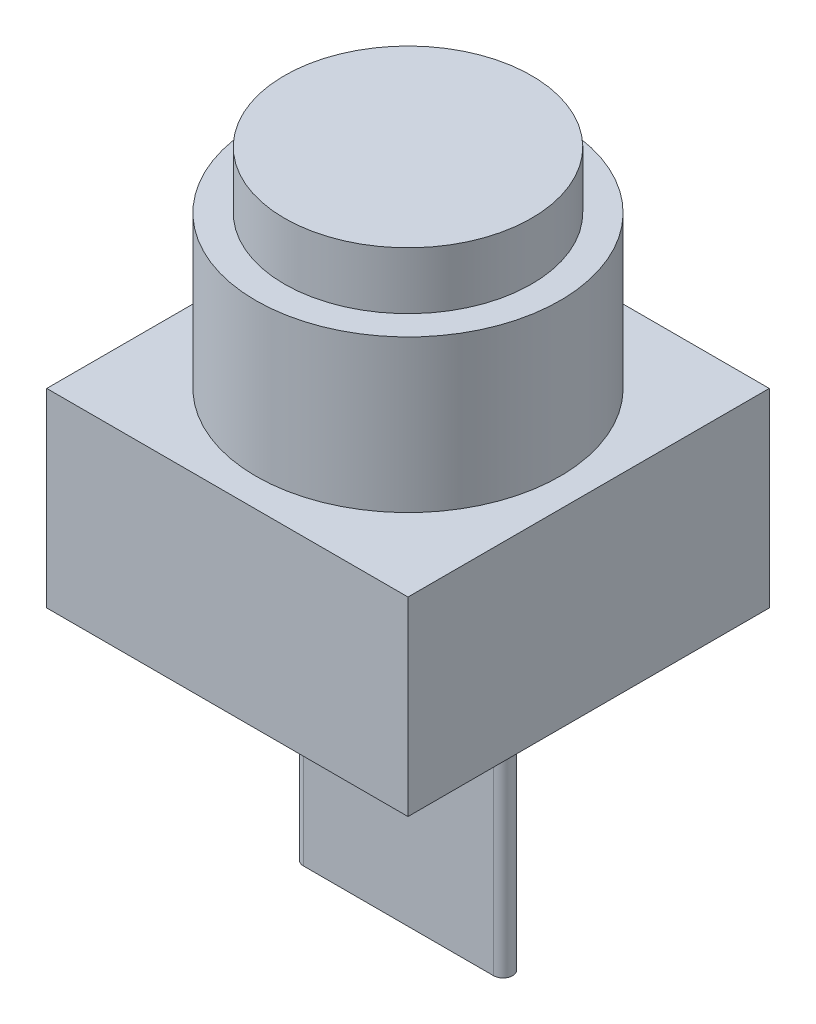
ISO-10303-21;
HEADER;
FILE_DESCRIPTION(('STEP AP214'),'2;1');
FILE_NAME('part.step','',(''),(''),'','','');
FILE_SCHEMA(('AUTOMOTIVE_DESIGN { 1 0 10303 214 1 1 1 1 }'));
ENDSEC;
DATA;
#1=APPLICATION_CONTEXT('core data for automotive mechanical design processes');
#2=APPLICATION_PROTOCOL_DEFINITION('international standard','automotive_design',2000,#1);
#3=PRODUCT_CONTEXT('',#1,'mechanical');
#4=PRODUCT('Part','Part','',(#3));
#5=PRODUCT_RELATED_PRODUCT_CATEGORY('part','',(#4));
#6=PRODUCT_DEFINITION_FORMATION('','',#4);
#7=PRODUCT_DEFINITION_CONTEXT('part definition',#1,'design');
#8=PRODUCT_DEFINITION('design','',#6,#7);
#9=PRODUCT_DEFINITION_SHAPE('','',#8);
#10=(LENGTH_UNIT() NAMED_UNIT(*) SI_UNIT(.MILLI.,.METRE.));
#11=(NAMED_UNIT(*) PLANE_ANGLE_UNIT() SI_UNIT($,.RADIAN.));
#12=(NAMED_UNIT(*) SI_UNIT($,.STERADIAN.) SOLID_ANGLE_UNIT());
#13=UNCERTAINTY_MEASURE_WITH_UNIT(LENGTH_MEASURE(1.E-05),#10,'distance_accuracy_value','');
#14=(GEOMETRIC_REPRESENTATION_CONTEXT(3) GLOBAL_UNCERTAINTY_ASSIGNED_CONTEXT((#13)) GLOBAL_UNIT_ASSIGNED_CONTEXT((#10,
#11,#12)) REPRESENTATION_CONTEXT('',''));
#15=CARTESIAN_POINT('',(0.,0.,0.));
#16=DIRECTION('',(0.,0.,1.));
#17=DIRECTION('',(1.,0.,0.));
#18=AXIS2_PLACEMENT_3D('',#15,#16,#17);
#19=CARTESIAN_POINT('',(0.,0.,0.));
#20=DIRECTION('',(0.,-1.,0.));
#21=DIRECTION('',(0.,0.,-1.));
#22=AXIS2_PLACEMENT_3D('',#19,#20,#21);
#23=PLANE('',#22);
#24=DIRECTION('',(0.,0.,-1.));
#25=VECTOR('',#24,1.);
#26=CARTESIAN_POINT('',(4.75,0.,4.75));
#27=LINE('',#26,#25);
#28=CARTESIAN_POINT('',(4.75,0.,4.75));
#29=VERTEX_POINT('',#28);
#30=CARTESIAN_POINT('',(4.75,0.,-4.75));
#31=VERTEX_POINT('',#30);
#32=EDGE_CURVE('E149',#29,#31,#27,.T.);
#33=ORIENTED_EDGE('',*,*,#32,.F.);
#34=DIRECTION('',(1.,0.,0.));
#35=VECTOR('',#34,1.);
#36=CARTESIAN_POINT('',(-4.75,0.,4.75));
#37=LINE('',#36,#35);
#38=CARTESIAN_POINT('',(-4.75,0.,4.75));
#39=VERTEX_POINT('',#38);
#40=EDGE_CURVE('E84',#39,#29,#37,.T.);
#41=ORIENTED_EDGE('',*,*,#40,.F.);
#42=DIRECTION('',(0.,0.,1.));
#43=VECTOR('',#42,1.);
#44=CARTESIAN_POINT('',(-4.75,0.,4.75));
#45=LINE('',#44,#43);
#46=CARTESIAN_POINT('',(-4.75,0.,-4.75));
#47=VERTEX_POINT('',#46);
#48=EDGE_CURVE('E163',#47,#39,#45,.T.);
#49=ORIENTED_EDGE('',*,*,#48,.F.);
#50=DIRECTION('',(-1.,0.,0.));
#51=VECTOR('',#50,1.);
#52=CARTESIAN_POINT('',(-4.75,0.,-4.75));
#53=LINE('',#52,#51);
#54=EDGE_CURVE('E161',#31,#47,#53,.T.);
#55=ORIENTED_EDGE('',*,*,#54,.F.);
#56=EDGE_LOOP('',(#33,#41,#49,#55));
#57=FACE_BOUND('',#56,.T.);
#58=DIRECTION('',(1.,0.,0.));
#59=VECTOR('',#58,1.);
#60=CARTESIAN_POINT('',(-2.5,0.,-0.25));
#61=LINE('',#60,#59);
#62=CARTESIAN_POINT('',(-2.5,0.,-0.25));
#63=VERTEX_POINT('',#62);
#64=CARTESIAN_POINT('',(2.5,0.,-0.25));
#65=VERTEX_POINT('',#64);
#66=EDGE_CURVE('E329',#63,#65,#61,.T.);
#67=ORIENTED_EDGE('',*,*,#66,.F.);
#68=CARTESIAN_POINT('',(-2.5,0.,0.));
#69=DIRECTION('',(0.,-1.,0.));
#70=DIRECTION('',(0.,0.,1.));
#71=AXIS2_PLACEMENT_3D('',#68,#69,#70);
#72=CIRCLE('',#71,0.25);
#73=CARTESIAN_POINT('',(-2.5,0.,0.25));
#74=VERTEX_POINT('',#73);
#75=EDGE_CURVE('E137',#74,#63,#72,.T.);
#76=ORIENTED_EDGE('',*,*,#75,.F.);
#77=DIRECTION('',(-1.,0.,0.));
#78=VECTOR('',#77,1.);
#79=CARTESIAN_POINT('',(-2.5,0.,0.25));
#80=LINE('',#79,#78);
#81=CARTESIAN_POINT('',(2.5,0.,0.25));
#82=VERTEX_POINT('',#81);
#83=EDGE_CURVE('E133',#82,#74,#80,.T.);
#84=ORIENTED_EDGE('',*,*,#83,.F.);
#85=CARTESIAN_POINT('',(2.5,0.,0.));
#86=DIRECTION('',(0.,-1.,0.));
#87=DIRECTION('',(0.,0.,-1.));
#88=AXIS2_PLACEMENT_3D('',#85,#86,#87);
#89=CIRCLE('',#88,0.25);
#90=EDGE_CURVE('E326',#65,#82,#89,.T.);
#91=ORIENTED_EDGE('',*,*,#90,.F.);
#92=EDGE_LOOP('',(#67,#76,#84,#91));
#93=FACE_BOUND('',#92,.T.);
#94=ADVANCED_FACE('F37',(#57,#93),#23,.T.);
#95=CARTESIAN_POINT('',(4.75,5.,4.75));
#96=DIRECTION('',(-1.,0.,0.));
#97=DIRECTION('',(0.,0.,1.));
#98=AXIS2_PLACEMENT_3D('',#95,#96,#97);
#99=PLANE('',#98);
#100=ORIENTED_EDGE('',*,*,#32,.T.);
#101=DIRECTION('',(0.,-1.,0.));
#102=VECTOR('',#101,1.);
#103=CARTESIAN_POINT('',(4.75,5.,-4.75));
#104=LINE('',#103,#102);
#105=CARTESIAN_POINT('',(4.75,5.,-4.75));
#106=VERTEX_POINT('',#105);
#107=EDGE_CURVE('E41',#106,#31,#104,.T.);
#108=ORIENTED_EDGE('',*,*,#107,.F.);
#109=DIRECTION('',(0.,0.,-1.));
#110=VECTOR('',#109,1.);
#111=CARTESIAN_POINT('',(4.75,5.,4.75));
#112=LINE('',#111,#110);
#113=CARTESIAN_POINT('',(4.75,5.,4.75));
#114=VERTEX_POINT('',#113);
#115=EDGE_CURVE('E152',#114,#106,#112,.T.);
#116=ORIENTED_EDGE('',*,*,#115,.F.);
#117=DIRECTION('',(0.,-1.,0.));
#118=VECTOR('',#117,1.);
#119=CARTESIAN_POINT('',(4.75,5.,4.75));
#120=LINE('',#119,#118);
#121=EDGE_CURVE('E158',#114,#29,#120,.T.);
#122=ORIENTED_EDGE('',*,*,#121,.T.);
#123=EDGE_LOOP('',(#100,#108,#116,#122));
#124=FACE_BOUND('',#123,.T.);
#125=ADVANCED_FACE('F39',(#124),#99,.F.);
#126=CARTESIAN_POINT('',(-4.75,5.,-4.75));
#127=DIRECTION('',(0.,0.,1.));
#128=DIRECTION('',(1.,0.,0.));
#129=AXIS2_PLACEMENT_3D('',#126,#127,#128);
#130=PLANE('',#129);
#131=ORIENTED_EDGE('',*,*,#54,.T.);
#132=DIRECTION('',(0.,-1.,0.));
#133=VECTOR('',#132,1.);
#134=CARTESIAN_POINT('',(-4.75,5.,-4.75));
#135=LINE('',#134,#133);
#136=CARTESIAN_POINT('',(-4.75,5.,-4.75));
#137=VERTEX_POINT('',#136);
#138=EDGE_CURVE('E168',#137,#47,#135,.T.);
#139=ORIENTED_EDGE('',*,*,#138,.F.);
#140=DIRECTION('',(-1.,0.,0.));
#141=VECTOR('',#140,1.);
#142=CARTESIAN_POINT('',(-4.75,5.,-4.75));
#143=LINE('',#142,#141);
#144=EDGE_CURVE('E92',#106,#137,#143,.T.);
#145=ORIENTED_EDGE('',*,*,#144,.F.);
#146=ORIENTED_EDGE('',*,*,#107,.T.);
#147=EDGE_LOOP('',(#131,#139,#145,#146));
#148=FACE_BOUND('',#147,.T.);
#149=ADVANCED_FACE('F174',(#148),#130,.F.);
#150=CARTESIAN_POINT('',(-4.75,5.,4.75));
#151=DIRECTION('',(1.,0.,0.));
#152=DIRECTION('',(0.,0.,-1.));
#153=AXIS2_PLACEMENT_3D('',#150,#151,#152);
#154=PLANE('',#153);
#155=ORIENTED_EDGE('',*,*,#48,.T.);
#156=DIRECTION('',(0.,-1.,0.));
#157=VECTOR('',#156,1.);
#158=CARTESIAN_POINT('',(-4.75,5.,4.75));
#159=LINE('',#158,#157);
#160=CARTESIAN_POINT('',(-4.75,5.,4.75));
#161=VERTEX_POINT('',#160);
#162=EDGE_CURVE('E167',#161,#39,#159,.T.);
#163=ORIENTED_EDGE('',*,*,#162,.F.);
#164=DIRECTION('',(0.,0.,1.));
#165=VECTOR('',#164,1.);
#166=CARTESIAN_POINT('',(-4.75,5.,4.75));
#167=LINE('',#166,#165);
#168=EDGE_CURVE('E155',#137,#161,#167,.T.);
#169=ORIENTED_EDGE('',*,*,#168,.F.);
#170=ORIENTED_EDGE('',*,*,#138,.T.);
#171=EDGE_LOOP('',(#155,#163,#169,#170));
#172=FACE_BOUND('',#171,.T.);
#173=ADVANCED_FACE('F181',(#172),#154,.F.);
#174=CARTESIAN_POINT('',(-4.75,5.,4.75));
#175=DIRECTION('',(0.,0.,-1.));
#176=DIRECTION('',(-1.,0.,0.));
#177=AXIS2_PLACEMENT_3D('',#174,#175,#176);
#178=PLANE('',#177);
#179=ORIENTED_EDGE('',*,*,#40,.T.);
#180=ORIENTED_EDGE('',*,*,#121,.F.);
#181=DIRECTION('',(1.,0.,0.));
#182=VECTOR('',#181,1.);
#183=CARTESIAN_POINT('',(-4.75,5.,4.75));
#184=LINE('',#183,#182);
#185=EDGE_CURVE('E63',#161,#114,#184,.T.);
#186=ORIENTED_EDGE('',*,*,#185,.F.);
#187=ORIENTED_EDGE('',*,*,#162,.T.);
#188=EDGE_LOOP('',(#179,#180,#186,#187));
#189=FACE_BOUND('',#188,.T.);
#190=ADVANCED_FACE('F182',(#189),#178,.F.);
#191=CARTESIAN_POINT('',(0.,5.,0.));
#192=DIRECTION('',(0.,-1.,0.));
#193=DIRECTION('',(0.,0.,-1.));
#194=AXIS2_PLACEMENT_3D('',#191,#192,#193);
#195=PLANE('',#194);
#196=CARTESIAN_POINT('',(0.,5.,0.));
#197=DIRECTION('',(0.,1.,0.));
#198=DIRECTION('',(0.,0.,1.));
#199=AXIS2_PLACEMENT_3D('',#196,#197,#198);
#200=CIRCLE('',#199,4.);
#201=CARTESIAN_POINT('',(0.,5.,4.));
#202=VERTEX_POINT('',#201);
#203=EDGE_CURVE('E46',#202,#202,#200,.T.);
#204=ORIENTED_EDGE('',*,*,#203,.F.);
#205=EDGE_LOOP('',(#204));
#206=FACE_BOUND('',#205,.T.);
#207=ORIENTED_EDGE('',*,*,#115,.T.);
#208=ORIENTED_EDGE('',*,*,#144,.T.);
#209=ORIENTED_EDGE('',*,*,#168,.T.);
#210=ORIENTED_EDGE('',*,*,#185,.T.);
#211=EDGE_LOOP('',(#207,#208,#209,#210));
#212=FACE_BOUND('',#211,.T.);
#213=ADVANCED_FACE('F183',(#206,#212),#195,.F.);
#214=CARTESIAN_POINT('',(0.,9.,0.));
#215=DIRECTION('',(0.,-1.,0.));
#216=DIRECTION('',(0.,0.,-1.));
#217=AXIS2_PLACEMENT_3D('',#214,#215,#216);
#218=CYLINDRICAL_SURFACE('',#217,4.);
#219=CARTESIAN_POINT('',(0.,9.,0.));
#220=DIRECTION('',(0.,1.,0.));
#221=DIRECTION('',(0.,0.,1.));
#222=AXIS2_PLACEMENT_3D('',#219,#220,#221);
#223=CIRCLE('',#222,4.);
#224=CARTESIAN_POINT('',(0.,9.,4.));
#225=VERTEX_POINT('',#224);
#226=EDGE_CURVE('E142',#225,#225,#223,.T.);
#227=ORIENTED_EDGE('',*,*,#226,.F.);
#228=EDGE_LOOP('',(#227));
#229=FACE_BOUND('',#228,.T.);
#230=ORIENTED_EDGE('',*,*,#203,.T.);
#231=EDGE_LOOP('',(#230));
#232=FACE_BOUND('',#231,.T.);
#233=ADVANCED_FACE('F185',(#229,#232),#218,.T.);
#234=CARTESIAN_POINT('',(0.,9.,0.));
#235=DIRECTION('',(0.,1.,0.));
#236=DIRECTION('',(0.,0.,1.));
#237=AXIS2_PLACEMENT_3D('',#234,#235,#236);
#238=PLANE('',#237);
#239=CARTESIAN_POINT('',(0.,9.,0.));
#240=DIRECTION('',(0.,1.,0.));
#241=DIRECTION('',(0.,0.,1.));
#242=AXIS2_PLACEMENT_3D('',#239,#240,#241);
#243=CIRCLE('',#242,3.25);
#244=CARTESIAN_POINT('',(0.,9.,3.25));
#245=VERTEX_POINT('',#244);
#246=EDGE_CURVE('E11',#245,#245,#243,.T.);
#247=ORIENTED_EDGE('',*,*,#246,.F.);
#248=EDGE_LOOP('',(#247));
#249=FACE_BOUND('',#248,.T.);
#250=ORIENTED_EDGE('',*,*,#226,.T.);
#251=EDGE_LOOP('',(#250));
#252=FACE_BOUND('',#251,.T.);
#253=ADVANCED_FACE('F192',(#249,#252),#238,.T.);
#254=CARTESIAN_POINT('',(0.,10.5,0.));
#255=DIRECTION('',(0.,-1.,0.));
#256=DIRECTION('',(0.,0.,-1.));
#257=AXIS2_PLACEMENT_3D('',#254,#255,#256);
#258=CYLINDRICAL_SURFACE('',#257,3.25);
#259=CARTESIAN_POINT('',(0.,10.5,0.));
#260=DIRECTION('',(0.,1.,0.));
#261=DIRECTION('',(0.,0.,1.));
#262=AXIS2_PLACEMENT_3D('',#259,#260,#261);
#263=CIRCLE('',#262,3.25);
#264=CARTESIAN_POINT('',(0.,10.5,3.25));
#265=VERTEX_POINT('',#264);
#266=EDGE_CURVE('E139',#265,#265,#263,.T.);
#267=ORIENTED_EDGE('',*,*,#266,.F.);
#268=EDGE_LOOP('',(#267));
#269=FACE_BOUND('',#268,.T.);
#270=ORIENTED_EDGE('',*,*,#246,.T.);
#271=EDGE_LOOP('',(#270));
#272=FACE_BOUND('',#271,.T.);
#273=ADVANCED_FACE('F239',(#269,#272),#258,.T.);
#274=CARTESIAN_POINT('',(0.,10.5,0.));
#275=DIRECTION('',(0.,1.,0.));
#276=DIRECTION('',(0.,0.,1.));
#277=AXIS2_PLACEMENT_3D('',#274,#275,#276);
#278=PLANE('',#277);
#279=ORIENTED_EDGE('',*,*,#266,.T.);
#280=EDGE_LOOP('',(#279));
#281=FACE_BOUND('',#280,.T.);
#282=ADVANCED_FACE('F250',(#281),#278,.T.);
#283=CARTESIAN_POINT('',(-2.5,-7.,0.));
#284=DIRECTION('',(0.,1.,0.));
#285=DIRECTION('',(0.,0.,1.));
#286=AXIS2_PLACEMENT_3D('',#283,#284,#285);
#287=CYLINDRICAL_SURFACE('',#286,0.25);
#288=ORIENTED_EDGE('',*,*,#75,.T.);
#289=DIRECTION('',(0.,1.,0.));
#290=VECTOR('',#289,1.);
#291=CARTESIAN_POINT('',(-2.5,-7.,-0.25));
#292=LINE('',#291,#290);
#293=CARTESIAN_POINT('',(-2.5,-7.,-0.25));
#294=VERTEX_POINT('',#293);
#295=EDGE_CURVE('E118',#294,#63,#292,.T.);
#296=ORIENTED_EDGE('',*,*,#295,.F.);
#297=CARTESIAN_POINT('',(-2.5,-7.,0.));
#298=DIRECTION('',(0.,-1.,0.));
#299=DIRECTION('',(0.,0.,1.));
#300=AXIS2_PLACEMENT_3D('',#297,#298,#299);
#301=CIRCLE('',#300,0.25);
#302=CARTESIAN_POINT('',(-2.5,-7.,0.25));
#303=VERTEX_POINT('',#302);
#304=EDGE_CURVE('E125',#303,#294,#301,.T.);
#305=ORIENTED_EDGE('',*,*,#304,.F.);
#306=DIRECTION('',(0.,1.,0.));
#307=VECTOR('',#306,1.);
#308=CARTESIAN_POINT('',(-2.5,-7.,0.25));
#309=LINE('',#308,#307);
#310=EDGE_CURVE('E324',#303,#74,#309,.T.);
#311=ORIENTED_EDGE('',*,*,#310,.T.);
#312=EDGE_LOOP('',(#288,#296,#305,#311));
#313=FACE_BOUND('',#312,.T.);
#314=ADVANCED_FACE('F135',(#313),#287,.T.);
#315=CARTESIAN_POINT('',(-2.5,-7.,-0.25));
#316=DIRECTION('',(0.,0.,1.));
#317=DIRECTION('',(1.,0.,0.));
#318=AXIS2_PLACEMENT_3D('',#315,#316,#317);
#319=PLANE('',#318);
#320=ORIENTED_EDGE('',*,*,#66,.T.);
#321=DIRECTION('',(0.,1.,0.));
#322=VECTOR('',#321,1.);
#323=CARTESIAN_POINT('',(2.5,-7.,-0.25));
#324=LINE('',#323,#322);
#325=CARTESIAN_POINT('',(2.5,-7.,-0.25));
#326=VERTEX_POINT('',#325);
#327=EDGE_CURVE('E121',#326,#65,#324,.T.);
#328=ORIENTED_EDGE('',*,*,#327,.F.);
#329=DIRECTION('',(1.,0.,0.));
#330=VECTOR('',#329,1.);
#331=CARTESIAN_POINT('',(-2.5,-7.,-0.25));
#332=LINE('',#331,#330);
#333=EDGE_CURVE('E114',#294,#326,#332,.T.);
#334=ORIENTED_EDGE('',*,*,#333,.F.);
#335=ORIENTED_EDGE('',*,*,#295,.T.);
#336=EDGE_LOOP('',(#320,#328,#334,#335));
#337=FACE_BOUND('',#336,.T.);
#338=ADVANCED_FACE('F116',(#337),#319,.F.);
#339=CARTESIAN_POINT('',(2.5,-7.,0.));
#340=DIRECTION('',(0.,1.,0.));
#341=DIRECTION('',(0.,0.,1.));
#342=AXIS2_PLACEMENT_3D('',#339,#340,#341);
#343=CYLINDRICAL_SURFACE('',#342,0.25);
#344=ORIENTED_EDGE('',*,*,#90,.T.);
#345=DIRECTION('',(0.,1.,0.));
#346=VECTOR('',#345,1.);
#347=CARTESIAN_POINT('',(2.5,-7.,0.250000000000001));
#348=LINE('',#347,#346);
#349=CARTESIAN_POINT('',(2.5,-7.,0.250000000000001));
#350=VERTEX_POINT('',#349);
#351=EDGE_CURVE('E54',#350,#82,#348,.T.);
#352=ORIENTED_EDGE('',*,*,#351,.F.);
#353=CARTESIAN_POINT('',(2.5,-7.,0.));
#354=DIRECTION('',(0.,-1.,0.));
#355=DIRECTION('',(0.,0.,-1.));
#356=AXIS2_PLACEMENT_3D('',#353,#354,#355);
#357=CIRCLE('',#356,0.25);
#358=EDGE_CURVE('E124',#326,#350,#357,.T.);
#359=ORIENTED_EDGE('',*,*,#358,.F.);
#360=ORIENTED_EDGE('',*,*,#327,.T.);
#361=EDGE_LOOP('',(#344,#352,#359,#360));
#362=FACE_BOUND('',#361,.T.);
#363=ADVANCED_FACE('F284',(#362),#343,.T.);
#364=CARTESIAN_POINT('',(-2.5,-7.,0.25));
#365=DIRECTION('',(0.,0.,-1.));
#366=DIRECTION('',(-1.,0.,0.));
#367=AXIS2_PLACEMENT_3D('',#364,#365,#366);
#368=PLANE('',#367);
#369=ORIENTED_EDGE('',*,*,#83,.T.);
#370=ORIENTED_EDGE('',*,*,#310,.F.);
#371=DIRECTION('',(-1.,0.,0.));
#372=VECTOR('',#371,1.);
#373=CARTESIAN_POINT('',(-2.5,-7.,0.25));
#374=LINE('',#373,#372);
#375=EDGE_CURVE('E129',#350,#303,#374,.T.);
#376=ORIENTED_EDGE('',*,*,#375,.F.);
#377=ORIENTED_EDGE('',*,*,#351,.T.);
#378=EDGE_LOOP('',(#369,#370,#376,#377));
#379=FACE_BOUND('',#378,.T.);
#380=ADVANCED_FACE('F294',(#379),#368,.F.);
#381=CARTESIAN_POINT('',(-2.5,-7.,0.));
#382=DIRECTION('',(0.,1.,0.));
#383=DIRECTION('',(0.,0.,1.));
#384=AXIS2_PLACEMENT_3D('',#381,#382,#383);
#385=PLANE('',#384);
#386=ORIENTED_EDGE('',*,*,#304,.T.);
#387=ORIENTED_EDGE('',*,*,#333,.T.);
#388=ORIENTED_EDGE('',*,*,#358,.T.);
#389=ORIENTED_EDGE('',*,*,#375,.T.);
#390=EDGE_LOOP('',(#386,#387,#388,#389));
#391=FACE_BOUND('',#390,.T.);
#392=ADVANCED_FACE('F128',(#391),#385,.F.);
#393=CLOSED_SHELL('',(#94,#125,#149,#173,#190,#213,#233,#253,#273,#282,#314,#338,#363,#380,#392));
#394=MANIFOLD_SOLID_BREP('B2',#393);
#395=ADVANCED_BREP_SHAPE_REPRESENTATION('',(#18,#394),#14);
#396=SHAPE_DEFINITION_REPRESENTATION(#9,#395);
ENDSEC;
END-ISO-10303-21;
